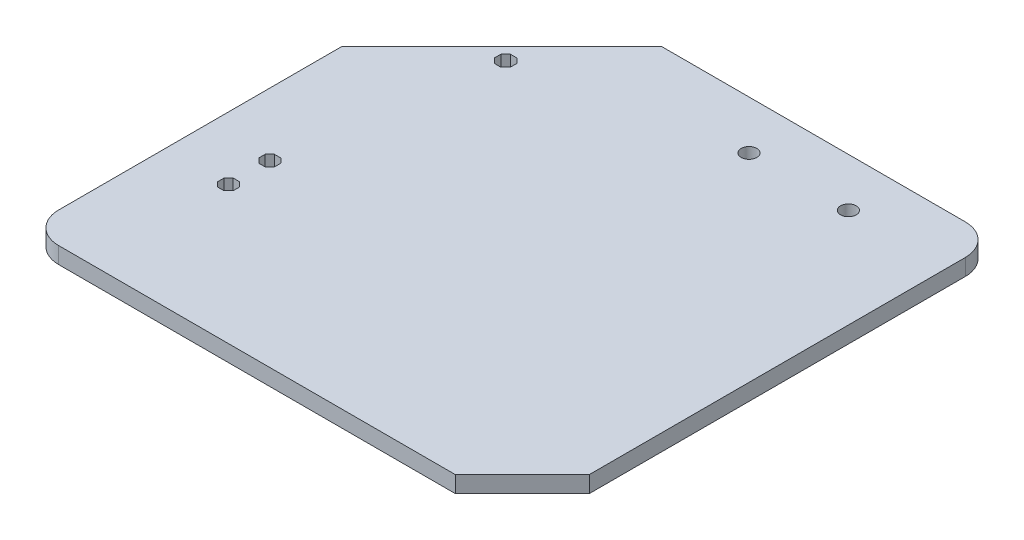
ISO-10303-21;
HEADER;
FILE_DESCRIPTION(('STEP AP214'),'2;1');
FILE_NAME('part.step','',(''),(''),'','','');
FILE_SCHEMA(('AUTOMOTIVE_DESIGN { 1 0 10303 214 1 1 1 1 }'));
ENDSEC;
DATA;
#1=APPLICATION_CONTEXT('core data for automotive mechanical design processes');
#2=APPLICATION_PROTOCOL_DEFINITION('international standard','automotive_design',2000,#1);
#3=PRODUCT_CONTEXT('',#1,'mechanical');
#4=PRODUCT('Part','Part','',(#3));
#5=PRODUCT_RELATED_PRODUCT_CATEGORY('part','',(#4));
#6=PRODUCT_DEFINITION_FORMATION('','',#4);
#7=PRODUCT_DEFINITION_CONTEXT('part definition',#1,'design');
#8=PRODUCT_DEFINITION('design','',#6,#7);
#9=PRODUCT_DEFINITION_SHAPE('','',#8);
#10=(LENGTH_UNIT() NAMED_UNIT(*) SI_UNIT(.MILLI.,.METRE.));
#11=(NAMED_UNIT(*) PLANE_ANGLE_UNIT() SI_UNIT($,.RADIAN.));
#12=(NAMED_UNIT(*) SI_UNIT($,.STERADIAN.) SOLID_ANGLE_UNIT());
#13=UNCERTAINTY_MEASURE_WITH_UNIT(LENGTH_MEASURE(1.E-05),#10,'distance_accuracy_value','');
#14=(GEOMETRIC_REPRESENTATION_CONTEXT(3) GLOBAL_UNCERTAINTY_ASSIGNED_CONTEXT((#13)) GLOBAL_UNIT_ASSIGNED_CONTEXT((#10,
#11,#12)) REPRESENTATION_CONTEXT('',''));
#15=CARTESIAN_POINT('',(0.,0.,0.));
#16=DIRECTION('',(0.,0.,1.));
#17=DIRECTION('',(1.,0.,0.));
#18=AXIS2_PLACEMENT_3D('',#15,#16,#17);
#19=CARTESIAN_POINT('',(24.,0.8,0.));
#20=DIRECTION('',(-1.,0.,0.));
#21=DIRECTION('',(0.,0.,1.));
#22=AXIS2_PLACEMENT_3D('',#19,#20,#21);
#23=PLANE('',#22);
#24=DIRECTION('',(0.,0.,-1.));
#25=VECTOR('',#24,1.);
#26=CARTESIAN_POINT('',(24.,0.,0.));
#27=LINE('',#26,#25);
#28=CARTESIAN_POINT('',(24.,0.,-8.));
#29=VERTEX_POINT('',#28);
#30=CARTESIAN_POINT('',(24.,0.,-26.25));
#31=VERTEX_POINT('',#30);
#32=EDGE_CURVE('E337',#29,#31,#27,.T.);
#33=ORIENTED_EDGE('',*,*,#32,.T.);
#34=DIRECTION('',(0.,-1.,0.));
#35=VECTOR('',#34,1.);
#36=CARTESIAN_POINT('',(24.,0.8,-26.25));
#37=LINE('',#36,#35);
#38=CARTESIAN_POINT('',(24.,0.8,-26.25));
#39=VERTEX_POINT('',#38);
#40=EDGE_CURVE('E11',#39,#31,#37,.T.);
#41=ORIENTED_EDGE('',*,*,#40,.F.);
#42=DIRECTION('',(0.,0.,-1.));
#43=VECTOR('',#42,1.);
#44=CARTESIAN_POINT('',(24.,0.8,0.));
#45=LINE('',#44,#43);
#46=CARTESIAN_POINT('',(24.,0.8,-8.));
#47=VERTEX_POINT('',#46);
#48=EDGE_CURVE('E504',#47,#39,#45,.T.);
#49=ORIENTED_EDGE('',*,*,#48,.F.);
#50=DIRECTION('',(0.,-1.,0.));
#51=VECTOR('',#50,1.);
#52=CARTESIAN_POINT('',(24.,0.8,-8.));
#53=LINE('',#52,#51);
#54=EDGE_CURVE('E52',#47,#29,#53,.T.);
#55=ORIENTED_EDGE('',*,*,#54,.T.);
#56=EDGE_LOOP('',(#33,#41,#49,#55));
#57=FACE_BOUND('',#56,.T.);
#58=ADVANCED_FACE('F33',(#57),#23,.F.);
#59=CARTESIAN_POINT('',(22.5,0.8,-26.25));
#60=DIRECTION('',(0.,-1.,0.));
#61=DIRECTION('',(0.,0.,-1.));
#62=AXIS2_PLACEMENT_3D('',#59,#60,#61);
#63=CYLINDRICAL_SURFACE('',#62,1.5);
#64=CARTESIAN_POINT('',(22.5,0.,-26.25));
#65=DIRECTION('',(0.,1.,0.));
#66=DIRECTION('',(0.,0.,1.));
#67=AXIS2_PLACEMENT_3D('',#64,#65,#66);
#68=CIRCLE('',#67,1.5);
#69=CARTESIAN_POINT('',(22.5,0.,-27.75));
#70=VERTEX_POINT('',#69);
#71=EDGE_CURVE('E339',#31,#70,#68,.T.);
#72=ORIENTED_EDGE('',*,*,#71,.T.);
#73=DIRECTION('',(0.,-1.,0.));
#74=VECTOR('',#73,1.);
#75=CARTESIAN_POINT('',(22.5,0.8,-27.75));
#76=LINE('',#75,#74);
#77=CARTESIAN_POINT('',(22.5,0.8,-27.75));
#78=VERTEX_POINT('',#77);
#79=EDGE_CURVE('E43',#78,#70,#76,.T.);
#80=ORIENTED_EDGE('',*,*,#79,.F.);
#81=CARTESIAN_POINT('',(22.5,0.8,-26.25));
#82=DIRECTION('',(0.,1.,0.));
#83=DIRECTION('',(0.,0.,1.));
#84=AXIS2_PLACEMENT_3D('',#81,#82,#83);
#85=CIRCLE('',#84,1.5);
#86=EDGE_CURVE('E506',#39,#78,#85,.T.);
#87=ORIENTED_EDGE('',*,*,#86,.F.);
#88=ORIENTED_EDGE('',*,*,#40,.T.);
#89=EDGE_LOOP('',(#72,#80,#87,#88));
#90=FACE_BOUND('',#89,.T.);
#91=ADVANCED_FACE('F536',(#90),#63,.T.);
#92=CARTESIAN_POINT('',(0.,0.8,-27.75));
#93=DIRECTION('',(0.,0.,1.));
#94=DIRECTION('',(1.,0.,0.));
#95=AXIS2_PLACEMENT_3D('',#92,#93,#94);
#96=PLANE('',#95);
#97=DIRECTION('',(-1.,0.,0.));
#98=VECTOR('',#97,1.);
#99=CARTESIAN_POINT('',(0.,0.,-27.75));
#100=LINE('',#99,#98);
#101=CARTESIAN_POINT('',(7.75,0.,-27.75));
#102=VERTEX_POINT('',#101);
#103=EDGE_CURVE('E341',#70,#102,#100,.T.);
#104=ORIENTED_EDGE('',*,*,#103,.T.);
#105=DIRECTION('',(0.,-1.,0.));
#106=VECTOR('',#105,1.);
#107=CARTESIAN_POINT('',(7.75,0.8,-27.75));
#108=LINE('',#107,#106);
#109=CARTESIAN_POINT('',(7.75,0.8,-27.75));
#110=VERTEX_POINT('',#109);
#111=EDGE_CURVE('E361',#110,#102,#108,.T.);
#112=ORIENTED_EDGE('',*,*,#111,.F.);
#113=DIRECTION('',(-1.,0.,0.));
#114=VECTOR('',#113,1.);
#115=CARTESIAN_POINT('',(0.,0.8,-27.75));
#116=LINE('',#115,#114);
#117=EDGE_CURVE('E508',#78,#110,#116,.T.);
#118=ORIENTED_EDGE('',*,*,#117,.F.);
#119=ORIENTED_EDGE('',*,*,#79,.T.);
#120=EDGE_LOOP('',(#104,#112,#118,#119));
#121=FACE_BOUND('',#120,.T.);
#122=ADVANCED_FACE('F541',(#121),#96,.F.);
#123=CARTESIAN_POINT('',(-10.,0.8,-10.));
#124=DIRECTION('',(0.707106781186548,0.,0.707106781186548));
#125=DIRECTION('',(0.707106781186548,0.,-0.707106781186548));
#126=AXIS2_PLACEMENT_3D('',#123,#124,#125);
#127=PLANE('',#126);
#128=DIRECTION('',(-0.707106781186548,0.,0.707106781186548));
#129=VECTOR('',#128,1.);
#130=CARTESIAN_POINT('',(-10.,0.,-10.));
#131=LINE('',#130,#129);
#132=CARTESIAN_POINT('',(0.,0.,-20.));
#133=VERTEX_POINT('',#132);
#134=EDGE_CURVE('E343',#102,#133,#131,.T.);
#135=ORIENTED_EDGE('',*,*,#134,.T.);
#136=DIRECTION('',(0.,-1.,0.));
#137=VECTOR('',#136,1.);
#138=CARTESIAN_POINT('',(0.,0.8,-20.));
#139=LINE('',#138,#137);
#140=CARTESIAN_POINT('',(0.,0.8,-20.));
#141=VERTEX_POINT('',#140);
#142=EDGE_CURVE('E358',#141,#133,#139,.T.);
#143=ORIENTED_EDGE('',*,*,#142,.F.);
#144=DIRECTION('',(-0.707106781186548,0.,0.707106781186548));
#145=VECTOR('',#144,1.);
#146=CARTESIAN_POINT('',(-10.,0.8,-10.));
#147=LINE('',#146,#145);
#148=EDGE_CURVE('E510',#110,#141,#147,.T.);
#149=ORIENTED_EDGE('',*,*,#148,.F.);
#150=ORIENTED_EDGE('',*,*,#111,.T.);
#151=EDGE_LOOP('',(#135,#143,#149,#150));
#152=FACE_BOUND('',#151,.T.);
#153=ADVANCED_FACE('F516',(#152),#127,.F.);
#154=CARTESIAN_POINT('',(0.,0.8,0.));
#155=DIRECTION('',(1.,0.,0.));
#156=DIRECTION('',(0.,0.,-1.));
#157=AXIS2_PLACEMENT_3D('',#154,#155,#156);
#158=PLANE('',#157);
#159=DIRECTION('',(0.,0.,1.));
#160=VECTOR('',#159,1.);
#161=CARTESIAN_POINT('',(0.,0.,0.));
#162=LINE('',#161,#160);
#163=CARTESIAN_POINT('',(0.,0.,-6.25));
#164=VERTEX_POINT('',#163);
#165=EDGE_CURVE('E345',#133,#164,#162,.T.);
#166=ORIENTED_EDGE('',*,*,#165,.T.);
#167=DIRECTION('',(0.,-1.,0.));
#168=VECTOR('',#167,1.);
#169=CARTESIAN_POINT('',(0.,0.8,-6.25));
#170=LINE('',#169,#168);
#171=CARTESIAN_POINT('',(0.,0.8,-6.25));
#172=VERTEX_POINT('',#171);
#173=EDGE_CURVE('E271',#172,#164,#170,.T.);
#174=ORIENTED_EDGE('',*,*,#173,.F.);
#175=DIRECTION('',(0.,0.,1.));
#176=VECTOR('',#175,1.);
#177=CARTESIAN_POINT('',(0.,0.8,0.));
#178=LINE('',#177,#176);
#179=EDGE_CURVE('E259',#141,#172,#178,.T.);
#180=ORIENTED_EDGE('',*,*,#179,.F.);
#181=ORIENTED_EDGE('',*,*,#142,.T.);
#182=EDGE_LOOP('',(#166,#174,#180,#181));
#183=FACE_BOUND('',#182,.T.);
#184=ADVANCED_FACE('F520',(#183),#158,.F.);
#185=CARTESIAN_POINT('',(1.5,0.8,-6.25));
#186=DIRECTION('',(0.,-1.,0.));
#187=DIRECTION('',(0.,0.,-1.));
#188=AXIS2_PLACEMENT_3D('',#185,#186,#187);
#189=CYLINDRICAL_SURFACE('',#188,1.5);
#190=CARTESIAN_POINT('',(1.5,0.,-6.25));
#191=DIRECTION('',(0.,1.,0.));
#192=DIRECTION('',(0.,0.,1.));
#193=AXIS2_PLACEMENT_3D('',#190,#191,#192);
#194=CIRCLE('',#193,1.5);
#195=CARTESIAN_POINT('',(1.5,0.,-4.75));
#196=VERTEX_POINT('',#195);
#197=EDGE_CURVE('E268',#164,#196,#194,.T.);
#198=ORIENTED_EDGE('',*,*,#197,.T.);
#199=DIRECTION('',(0.,-1.,0.));
#200=VECTOR('',#199,1.);
#201=CARTESIAN_POINT('',(1.5,0.8,-4.75));
#202=LINE('',#201,#200);
#203=CARTESIAN_POINT('',(1.5,0.8,-4.75));
#204=VERTEX_POINT('',#203);
#205=EDGE_CURVE('E265',#204,#196,#202,.T.);
#206=ORIENTED_EDGE('',*,*,#205,.F.);
#207=CARTESIAN_POINT('',(1.5,0.8,-6.25));
#208=DIRECTION('',(0.,1.,0.));
#209=DIRECTION('',(0.,0.,1.));
#210=AXIS2_PLACEMENT_3D('',#207,#208,#209);
#211=CIRCLE('',#210,1.5);
#212=EDGE_CURVE('E251',#172,#204,#211,.T.);
#213=ORIENTED_EDGE('',*,*,#212,.F.);
#214=ORIENTED_EDGE('',*,*,#173,.T.);
#215=EDGE_LOOP('',(#198,#206,#213,#214));
#216=FACE_BOUND('',#215,.T.);
#217=ADVANCED_FACE('F266',(#216),#189,.T.);
#218=CARTESIAN_POINT('',(0.,0.8,-4.75));
#219=DIRECTION('',(0.,0.,-1.));
#220=DIRECTION('',(-1.,0.,0.));
#221=AXIS2_PLACEMENT_3D('',#218,#219,#220);
#222=PLANE('',#221);
#223=DIRECTION('',(1.,0.,0.));
#224=VECTOR('',#223,1.);
#225=CARTESIAN_POINT('',(0.,0.,-4.75));
#226=LINE('',#225,#224);
#227=CARTESIAN_POINT('',(20.75,0.,-4.75));
#228=VERTEX_POINT('',#227);
#229=EDGE_CURVE('E348',#196,#228,#226,.T.);
#230=ORIENTED_EDGE('',*,*,#229,.T.);
#231=DIRECTION('',(0.,-1.,0.));
#232=VECTOR('',#231,1.);
#233=CARTESIAN_POINT('',(20.75,0.8,-4.75));
#234=LINE('',#233,#232);
#235=CARTESIAN_POINT('',(20.75,0.8,-4.75));
#236=VERTEX_POINT('',#235);
#237=EDGE_CURVE('E151',#236,#228,#234,.T.);
#238=ORIENTED_EDGE('',*,*,#237,.F.);
#239=DIRECTION('',(1.,0.,0.));
#240=VECTOR('',#239,1.);
#241=CARTESIAN_POINT('',(0.,0.8,-4.75));
#242=LINE('',#241,#240);
#243=EDGE_CURVE('E257',#204,#236,#242,.T.);
#244=ORIENTED_EDGE('',*,*,#243,.F.);
#245=ORIENTED_EDGE('',*,*,#205,.T.);
#246=EDGE_LOOP('',(#230,#238,#244,#245));
#247=FACE_BOUND('',#246,.T.);
#248=ADVANCED_FACE('F273',(#247),#222,.F.);
#249=CARTESIAN_POINT('',(3.4258,0.8,0.));
#250=DIRECTION('',(1.,0.,0.));
#251=DIRECTION('',(0.,0.,-1.));
#252=AXIS2_PLACEMENT_3D('',#249,#250,#251);
#253=PLANE('',#252);
#254=DIRECTION('',(0.,0.,1.));
#255=VECTOR('',#254,1.);
#256=CARTESIAN_POINT('',(3.4258,0.,0.));
#257=LINE('',#256,#255);
#258=CARTESIAN_POINT('',(3.4258,0.,-11.60256032));
#259=VERTEX_POINT('',#258);
#260=CARTESIAN_POINT('',(3.4258,0.,-11.28943968));
#261=VERTEX_POINT('',#260);
#262=EDGE_CURVE('E320',#259,#261,#257,.T.);
#263=ORIENTED_EDGE('',*,*,#262,.T.);
#264=DIRECTION('',(0.,-1.,0.));
#265=VECTOR('',#264,1.);
#266=CARTESIAN_POINT('',(3.4258,0.8,-11.28943968));
#267=LINE('',#266,#265);
#268=CARTESIAN_POINT('',(3.4258,0.8,-11.28943968));
#269=VERTEX_POINT('',#268);
#270=EDGE_CURVE('E355',#269,#261,#267,.T.);
#271=ORIENTED_EDGE('',*,*,#270,.F.);
#272=DIRECTION('',(0.,0.,1.));
#273=VECTOR('',#272,1.);
#274=CARTESIAN_POINT('',(3.4258,0.8,0.));
#275=LINE('',#274,#273);
#276=CARTESIAN_POINT('',(3.4258,0.8,-11.60256032));
#277=VERTEX_POINT('',#276);
#278=EDGE_CURVE('E487',#277,#269,#275,.T.);
#279=ORIENTED_EDGE('',*,*,#278,.F.);
#280=DIRECTION('',(0.,-1.,0.));
#281=VECTOR('',#280,1.);
#282=CARTESIAN_POINT('',(3.4258,0.8,-11.60256032));
#283=LINE('',#282,#281);
#284=EDGE_CURVE('E366',#277,#259,#283,.T.);
#285=ORIENTED_EDGE('',*,*,#284,.T.);
#286=EDGE_LOOP('',(#263,#271,#279,#285));
#287=FACE_BOUND('',#286,.T.);
#288=ADVANCED_FACE('F576',(#287),#253,.F.);
#289=CARTESIAN_POINT('',(-3.93181984,0.8,-3.93181983999999));
#290=DIRECTION('',(0.707106781186548,0.,0.707106781186547));
#291=DIRECTION('',(0.707106781186547,0.,-0.707106781186548));
#292=AXIS2_PLACEMENT_3D('',#289,#290,#291);
#293=PLANE('',#292);
#294=DIRECTION('',(-0.707106781186547,0.,0.707106781186548));
#295=VECTOR('',#294,1.);
#296=CARTESIAN_POINT('',(-3.93181984,0.,-3.93181983999999));
#297=LINE('',#296,#295);
#298=CARTESIAN_POINT('',(3.20456032,0.,-11.0682));
#299=VERTEX_POINT('',#298);
#300=EDGE_CURVE('E323',#261,#299,#297,.T.);
#301=ORIENTED_EDGE('',*,*,#300,.T.);
#302=DIRECTION('',(0.,-1.,0.));
#303=VECTOR('',#302,1.);
#304=CARTESIAN_POINT('',(3.20456032,0.8,-11.0682));
#305=LINE('',#304,#303);
#306=CARTESIAN_POINT('',(3.20456032,0.8,-11.0682));
#307=VERTEX_POINT('',#306);
#308=EDGE_CURVE('E385',#307,#299,#305,.T.);
#309=ORIENTED_EDGE('',*,*,#308,.F.);
#310=DIRECTION('',(-0.707106781186547,0.,0.707106781186548));
#311=VECTOR('',#310,1.);
#312=CARTESIAN_POINT('',(-3.93181984,0.8,-3.93181983999999));
#313=LINE('',#312,#311);
#314=EDGE_CURVE('E490',#269,#307,#313,.T.);
#315=ORIENTED_EDGE('',*,*,#314,.F.);
#316=ORIENTED_EDGE('',*,*,#270,.T.);
#317=EDGE_LOOP('',(#301,#309,#315,#316));
#318=FACE_BOUND('',#317,.T.);
#319=ADVANCED_FACE('F572',(#318),#293,.F.);
#320=CARTESIAN_POINT('',(0.,0.8,-11.0682));
#321=DIRECTION('',(0.,0.,1.));
#322=DIRECTION('',(1.,0.,0.));
#323=AXIS2_PLACEMENT_3D('',#320,#321,#322);
#324=PLANE('',#323);
#325=DIRECTION('',(-1.,0.,0.));
#326=VECTOR('',#325,1.);
#327=CARTESIAN_POINT('',(0.,0.,-11.0682));
#328=LINE('',#327,#326);
#329=CARTESIAN_POINT('',(2.89143968,0.,-11.0682));
#330=VERTEX_POINT('',#329);
#331=EDGE_CURVE('E325',#299,#330,#328,.T.);
#332=ORIENTED_EDGE('',*,*,#331,.T.);
#333=DIRECTION('',(0.,-1.,0.));
#334=VECTOR('',#333,1.);
#335=CARTESIAN_POINT('',(2.89143968,0.8,-11.0682));
#336=LINE('',#335,#334);
#337=CARTESIAN_POINT('',(2.89143968,0.8,-11.0682));
#338=VERTEX_POINT('',#337);
#339=EDGE_CURVE('E382',#338,#330,#336,.T.);
#340=ORIENTED_EDGE('',*,*,#339,.F.);
#341=DIRECTION('',(-1.,0.,0.));
#342=VECTOR('',#341,1.);
#343=CARTESIAN_POINT('',(0.,0.8,-11.0682));
#344=LINE('',#343,#342);
#345=EDGE_CURVE('E492',#307,#338,#344,.T.);
#346=ORIENTED_EDGE('',*,*,#345,.F.);
#347=ORIENTED_EDGE('',*,*,#308,.T.);
#348=EDGE_LOOP('',(#332,#340,#346,#347));
#349=FACE_BOUND('',#348,.T.);
#350=ADVANCED_FACE('F568',(#349),#324,.F.);
#351=CARTESIAN_POINT('',(6.97981984000001,0.8,-6.97981983999998));
#352=DIRECTION('',(-0.707106781186549,0.,0.707106781186546));
#353=DIRECTION('',(0.707106781186546,0.,0.707106781186549));
#354=AXIS2_PLACEMENT_3D('',#351,#352,#353);
#355=PLANE('',#354);
#356=DIRECTION('',(-0.707106781186546,0.,-0.707106781186549));
#357=VECTOR('',#356,1.);
#358=CARTESIAN_POINT('',(6.97981984000001,0.,-6.97981983999998));
#359=LINE('',#358,#357);
#360=CARTESIAN_POINT('',(2.6702,0.,-11.28943968));
#361=VERTEX_POINT('',#360);
#362=EDGE_CURVE('E327',#330,#361,#359,.T.);
#363=ORIENTED_EDGE('',*,*,#362,.T.);
#364=DIRECTION('',(0.,-1.,0.));
#365=VECTOR('',#364,1.);
#366=CARTESIAN_POINT('',(2.6702,0.8,-11.28943968));
#367=LINE('',#366,#365);
#368=CARTESIAN_POINT('',(2.6702,0.8,-11.28943968));
#369=VERTEX_POINT('',#368);
#370=EDGE_CURVE('E379',#369,#361,#367,.T.);
#371=ORIENTED_EDGE('',*,*,#370,.F.);
#372=DIRECTION('',(-0.707106781186546,0.,-0.707106781186549));
#373=VECTOR('',#372,1.);
#374=CARTESIAN_POINT('',(6.97981984000001,0.8,-6.97981983999998));
#375=LINE('',#374,#373);
#376=EDGE_CURVE('E494',#338,#369,#375,.T.);
#377=ORIENTED_EDGE('',*,*,#376,.F.);
#378=ORIENTED_EDGE('',*,*,#339,.T.);
#379=EDGE_LOOP('',(#363,#371,#377,#378));
#380=FACE_BOUND('',#379,.T.);
#381=ADVANCED_FACE('F564',(#380),#355,.F.);
#382=CARTESIAN_POINT('',(2.6702,0.8,0.));
#383=DIRECTION('',(-1.,0.,0.));
#384=DIRECTION('',(0.,0.,1.));
#385=AXIS2_PLACEMENT_3D('',#382,#383,#384);
#386=PLANE('',#385);
#387=DIRECTION('',(0.,0.,-1.));
#388=VECTOR('',#387,1.);
#389=CARTESIAN_POINT('',(2.6702,0.,0.));
#390=LINE('',#389,#388);
#391=CARTESIAN_POINT('',(2.6702,0.,-11.60256032));
#392=VERTEX_POINT('',#391);
#393=EDGE_CURVE('E329',#361,#392,#390,.T.);
#394=ORIENTED_EDGE('',*,*,#393,.T.);
#395=DIRECTION('',(0.,-1.,0.));
#396=VECTOR('',#395,1.);
#397=CARTESIAN_POINT('',(2.6702,0.8,-11.60256032));
#398=LINE('',#397,#396);
#399=CARTESIAN_POINT('',(2.6702,0.8,-11.60256032));
#400=VERTEX_POINT('',#399);
#401=EDGE_CURVE('E376',#400,#392,#398,.T.);
#402=ORIENTED_EDGE('',*,*,#401,.F.);
#403=DIRECTION('',(0.,0.,-1.));
#404=VECTOR('',#403,1.);
#405=CARTESIAN_POINT('',(2.6702,0.8,0.));
#406=LINE('',#405,#404);
#407=EDGE_CURVE('E496',#369,#400,#406,.T.);
#408=ORIENTED_EDGE('',*,*,#407,.F.);
#409=ORIENTED_EDGE('',*,*,#370,.T.);
#410=EDGE_LOOP('',(#394,#402,#408,#409));
#411=FACE_BOUND('',#410,.T.);
#412=ADVANCED_FACE('F560',(#411),#386,.F.);
#413=CARTESIAN_POINT('',(-4.46618015999999,0.8,-4.46618015999998));
#414=DIRECTION('',(-0.707106781186549,0.,-0.707106781186546));
#415=DIRECTION('',(-0.707106781186546,0.,0.707106781186549));
#416=AXIS2_PLACEMENT_3D('',#413,#414,#415);
#417=PLANE('',#416);
#418=DIRECTION('',(0.707106781186546,0.,-0.707106781186549));
#419=VECTOR('',#418,1.);
#420=CARTESIAN_POINT('',(-4.46618015999999,0.,-4.46618015999998));
#421=LINE('',#420,#419);
#422=CARTESIAN_POINT('',(2.89143968,0.,-11.8238));
#423=VERTEX_POINT('',#422);
#424=EDGE_CURVE('E331',#392,#423,#421,.T.);
#425=ORIENTED_EDGE('',*,*,#424,.T.);
#426=DIRECTION('',(0.,-1.,0.));
#427=VECTOR('',#426,1.);
#428=CARTESIAN_POINT('',(2.89143968,0.8,-11.8238));
#429=LINE('',#428,#427);
#430=CARTESIAN_POINT('',(2.89143968,0.8,-11.8238));
#431=VERTEX_POINT('',#430);
#432=EDGE_CURVE('E373',#431,#423,#429,.T.);
#433=ORIENTED_EDGE('',*,*,#432,.F.);
#434=DIRECTION('',(0.707106781186546,0.,-0.707106781186549));
#435=VECTOR('',#434,1.);
#436=CARTESIAN_POINT('',(-4.46618015999999,0.8,-4.46618015999998));
#437=LINE('',#436,#435);
#438=EDGE_CURVE('E498',#400,#431,#437,.T.);
#439=ORIENTED_EDGE('',*,*,#438,.F.);
#440=ORIENTED_EDGE('',*,*,#401,.T.);
#441=EDGE_LOOP('',(#425,#433,#439,#440));
#442=FACE_BOUND('',#441,.T.);
#443=ADVANCED_FACE('F556',(#442),#417,.F.);
#444=CARTESIAN_POINT('',(0.,0.8,-11.8238));
#445=DIRECTION('',(0.,0.,-1.));
#446=DIRECTION('',(-1.,0.,0.));
#447=AXIS2_PLACEMENT_3D('',#444,#445,#446);
#448=PLANE('',#447);
#449=DIRECTION('',(1.,0.,0.));
#450=VECTOR('',#449,1.);
#451=CARTESIAN_POINT('',(0.,0.,-11.8238));
#452=LINE('',#451,#450);
#453=CARTESIAN_POINT('',(3.20456032,0.,-11.8238));
#454=VERTEX_POINT('',#453);
#455=EDGE_CURVE('E333',#423,#454,#452,.T.);
#456=ORIENTED_EDGE('',*,*,#455,.T.);
#457=DIRECTION('',(0.,-1.,0.));
#458=VECTOR('',#457,1.);
#459=CARTESIAN_POINT('',(3.20456032,0.8,-11.8238));
#460=LINE('',#459,#458);
#461=CARTESIAN_POINT('',(3.20456032,0.8,-11.8238));
#462=VERTEX_POINT('',#461);
#463=EDGE_CURVE('E369',#462,#454,#460,.T.);
#464=ORIENTED_EDGE('',*,*,#463,.F.);
#465=DIRECTION('',(1.,0.,0.));
#466=VECTOR('',#465,1.);
#467=CARTESIAN_POINT('',(0.,0.8,-11.8238));
#468=LINE('',#467,#466);
#469=EDGE_CURVE('E500',#431,#462,#468,.T.);
#470=ORIENTED_EDGE('',*,*,#469,.F.);
#471=ORIENTED_EDGE('',*,*,#432,.T.);
#472=EDGE_LOOP('',(#456,#464,#470,#471));
#473=FACE_BOUND('',#472,.T.);
#474=ADVANCED_FACE('F552',(#473),#448,.F.);
#475=CARTESIAN_POINT('',(3.4258,0.8,0.));
#476=DIRECTION('',(1.,0.,0.));
#477=DIRECTION('',(0.,0.,-1.));
#478=AXIS2_PLACEMENT_3D('',#475,#476,#477);
#479=PLANE('',#478);
#480=DIRECTION('',(0.,0.,1.));
#481=VECTOR('',#480,1.);
#482=CARTESIAN_POINT('',(3.4258,0.,0.));
#483=LINE('',#482,#481);
#484=CARTESIAN_POINT('',(3.4258,0.,-13.60256032));
#485=VERTEX_POINT('',#484);
#486=CARTESIAN_POINT('',(3.4258,0.,-13.28943968));
#487=VERTEX_POINT('',#486);
#488=EDGE_CURVE('E303',#485,#487,#483,.T.);
#489=ORIENTED_EDGE('',*,*,#488,.T.);
#490=DIRECTION('',(0.,-1.,0.));
#491=VECTOR('',#490,1.);
#492=CARTESIAN_POINT('',(3.4258,0.8,-13.28943968));
#493=LINE('',#492,#491);
#494=CARTESIAN_POINT('',(3.4258,0.8,-13.28943968));
#495=VERTEX_POINT('',#494);
#496=EDGE_CURVE('E370',#495,#487,#493,.T.);
#497=ORIENTED_EDGE('',*,*,#496,.F.);
#498=DIRECTION('',(0.,0.,1.));
#499=VECTOR('',#498,1.);
#500=CARTESIAN_POINT('',(3.4258,0.8,0.));
#501=LINE('',#500,#499);
#502=CARTESIAN_POINT('',(3.4258,0.8,-13.60256032));
#503=VERTEX_POINT('',#502);
#504=EDGE_CURVE('E470',#503,#495,#501,.T.);
#505=ORIENTED_EDGE('',*,*,#504,.F.);
#506=DIRECTION('',(0.,-1.,0.));
#507=VECTOR('',#506,1.);
#508=CARTESIAN_POINT('',(3.4258,0.8,-13.60256032));
#509=LINE('',#508,#507);
#510=EDGE_CURVE('E390',#503,#485,#509,.T.);
#511=ORIENTED_EDGE('',*,*,#510,.T.);
#512=EDGE_LOOP('',(#489,#497,#505,#511));
#513=FACE_BOUND('',#512,.T.);
#514=ADVANCED_FACE('F555',(#513),#479,.F.);
#515=CARTESIAN_POINT('',(-4.93181984,0.8,-4.93181983999999));
#516=DIRECTION('',(0.707106781186548,0.,0.707106781186547));
#517=DIRECTION('',(0.707106781186547,0.,-0.707106781186548));
#518=AXIS2_PLACEMENT_3D('',#515,#516,#517);
#519=PLANE('',#518);
#520=DIRECTION('',(-0.707106781186547,0.,0.707106781186548));
#521=VECTOR('',#520,1.);
#522=CARTESIAN_POINT('',(-4.93181984,0.,-4.93181983999999));
#523=LINE('',#522,#521);
#524=CARTESIAN_POINT('',(3.20456032,0.,-13.0682));
#525=VERTEX_POINT('',#524);
#526=EDGE_CURVE('E306',#487,#525,#523,.T.);
#527=ORIENTED_EDGE('',*,*,#526,.T.);
#528=DIRECTION('',(0.,-1.,0.));
#529=VECTOR('',#528,1.);
#530=CARTESIAN_POINT('',(3.20456032,0.8,-13.0682));
#531=LINE('',#530,#529);
#532=CARTESIAN_POINT('',(3.20456032,0.8,-13.0682));
#533=VERTEX_POINT('',#532);
#534=EDGE_CURVE('E408',#533,#525,#531,.T.);
#535=ORIENTED_EDGE('',*,*,#534,.F.);
#536=DIRECTION('',(-0.707106781186547,0.,0.707106781186548));
#537=VECTOR('',#536,1.);
#538=CARTESIAN_POINT('',(-4.93181984,0.8,-4.93181983999999));
#539=LINE('',#538,#537);
#540=EDGE_CURVE('E473',#495,#533,#539,.T.);
#541=ORIENTED_EDGE('',*,*,#540,.F.);
#542=ORIENTED_EDGE('',*,*,#496,.T.);
#543=EDGE_LOOP('',(#527,#535,#541,#542));
#544=FACE_BOUND('',#543,.T.);
#545=ADVANCED_FACE('F604',(#544),#519,.F.);
#546=CARTESIAN_POINT('',(0.,0.8,-13.0682));
#547=DIRECTION('',(0.,0.,1.));
#548=DIRECTION('',(1.,0.,0.));
#549=AXIS2_PLACEMENT_3D('',#546,#547,#548);
#550=PLANE('',#549);
#551=DIRECTION('',(-1.,0.,0.));
#552=VECTOR('',#551,1.);
#553=CARTESIAN_POINT('',(0.,0.,-13.0682));
#554=LINE('',#553,#552);
#555=CARTESIAN_POINT('',(2.89143968,0.,-13.0682));
#556=VERTEX_POINT('',#555);
#557=EDGE_CURVE('E308',#525,#556,#554,.T.);
#558=ORIENTED_EDGE('',*,*,#557,.T.);
#559=DIRECTION('',(0.,-1.,0.));
#560=VECTOR('',#559,1.);
#561=CARTESIAN_POINT('',(2.89143968,0.8,-13.0682));
#562=LINE('',#561,#560);
#563=CARTESIAN_POINT('',(2.89143968,0.8,-13.0682));
#564=VERTEX_POINT('',#563);
#565=EDGE_CURVE('E405',#564,#556,#562,.T.);
#566=ORIENTED_EDGE('',*,*,#565,.F.);
#567=DIRECTION('',(-1.,0.,0.));
#568=VECTOR('',#567,1.);
#569=CARTESIAN_POINT('',(0.,0.8,-13.0682));
#570=LINE('',#569,#568);
#571=EDGE_CURVE('E475',#533,#564,#570,.T.);
#572=ORIENTED_EDGE('',*,*,#571,.F.);
#573=ORIENTED_EDGE('',*,*,#534,.T.);
#574=EDGE_LOOP('',(#558,#566,#572,#573));
#575=FACE_BOUND('',#574,.T.);
#576=ADVANCED_FACE('F600',(#575),#550,.F.);
#577=CARTESIAN_POINT('',(7.97981984,0.8,-7.97981983999997));
#578=DIRECTION('',(-0.707106781186549,0.,0.707106781186546));
#579=DIRECTION('',(0.707106781186546,0.,0.707106781186549));
#580=AXIS2_PLACEMENT_3D('',#577,#578,#579);
#581=PLANE('',#580);
#582=DIRECTION('',(-0.707106781186546,0.,-0.707106781186549));
#583=VECTOR('',#582,1.);
#584=CARTESIAN_POINT('',(7.97981984,0.,-7.97981983999997));
#585=LINE('',#584,#583);
#586=CARTESIAN_POINT('',(2.6702,0.,-13.28943968));
#587=VERTEX_POINT('',#586);
#588=EDGE_CURVE('E310',#556,#587,#585,.T.);
#589=ORIENTED_EDGE('',*,*,#588,.T.);
#590=DIRECTION('',(0.,-1.,0.));
#591=VECTOR('',#590,1.);
#592=CARTESIAN_POINT('',(2.6702,0.8,-13.28943968));
#593=LINE('',#592,#591);
#594=CARTESIAN_POINT('',(2.6702,0.8,-13.28943968));
#595=VERTEX_POINT('',#594);
#596=EDGE_CURVE('E402',#595,#587,#593,.T.);
#597=ORIENTED_EDGE('',*,*,#596,.F.);
#598=DIRECTION('',(-0.707106781186546,0.,-0.707106781186549));
#599=VECTOR('',#598,1.);
#600=CARTESIAN_POINT('',(7.97981984,0.8,-7.97981983999997));
#601=LINE('',#600,#599);
#602=EDGE_CURVE('E477',#564,#595,#601,.T.);
#603=ORIENTED_EDGE('',*,*,#602,.F.);
#604=ORIENTED_EDGE('',*,*,#565,.T.);
#605=EDGE_LOOP('',(#589,#597,#603,#604));
#606=FACE_BOUND('',#605,.T.);
#607=ADVANCED_FACE('F596',(#606),#581,.F.);
#608=CARTESIAN_POINT('',(2.6702,0.8,0.));
#609=DIRECTION('',(-1.,0.,0.));
#610=DIRECTION('',(0.,0.,1.));
#611=AXIS2_PLACEMENT_3D('',#608,#609,#610);
#612=PLANE('',#611);
#613=DIRECTION('',(0.,0.,-1.));
#614=VECTOR('',#613,1.);
#615=CARTESIAN_POINT('',(2.6702,0.,0.));
#616=LINE('',#615,#614);
#617=CARTESIAN_POINT('',(2.6702,0.,-13.60256032));
#618=VERTEX_POINT('',#617);
#619=EDGE_CURVE('E312',#587,#618,#616,.T.);
#620=ORIENTED_EDGE('',*,*,#619,.T.);
#621=DIRECTION('',(0.,-1.,0.));
#622=VECTOR('',#621,1.);
#623=CARTESIAN_POINT('',(2.6702,0.8,-13.60256032));
#624=LINE('',#623,#622);
#625=CARTESIAN_POINT('',(2.6702,0.8,-13.60256032));
#626=VERTEX_POINT('',#625);
#627=EDGE_CURVE('E399',#626,#618,#624,.T.);
#628=ORIENTED_EDGE('',*,*,#627,.F.);
#629=DIRECTION('',(0.,0.,-1.));
#630=VECTOR('',#629,1.);
#631=CARTESIAN_POINT('',(2.6702,0.8,0.));
#632=LINE('',#631,#630);
#633=EDGE_CURVE('E479',#595,#626,#632,.T.);
#634=ORIENTED_EDGE('',*,*,#633,.F.);
#635=ORIENTED_EDGE('',*,*,#596,.T.);
#636=EDGE_LOOP('',(#620,#628,#634,#635));
#637=FACE_BOUND('',#636,.T.);
#638=ADVANCED_FACE('F592',(#637),#612,.F.);
#639=CARTESIAN_POINT('',(-5.46618015999999,0.8,-5.46618015999997));
#640=DIRECTION('',(-0.707106781186549,0.,-0.707106781186546));
#641=DIRECTION('',(-0.707106781186546,0.,0.707106781186549));
#642=AXIS2_PLACEMENT_3D('',#639,#640,#641);
#643=PLANE('',#642);
#644=DIRECTION('',(0.707106781186546,0.,-0.707106781186549));
#645=VECTOR('',#644,1.);
#646=CARTESIAN_POINT('',(-5.46618015999999,0.,-5.46618015999997));
#647=LINE('',#646,#645);
#648=CARTESIAN_POINT('',(2.89143968,0.,-13.8238));
#649=VERTEX_POINT('',#648);
#650=EDGE_CURVE('E314',#618,#649,#647,.T.);
#651=ORIENTED_EDGE('',*,*,#650,.T.);
#652=DIRECTION('',(0.,-1.,0.));
#653=VECTOR('',#652,1.);
#654=CARTESIAN_POINT('',(2.89143968,0.8,-13.8238));
#655=LINE('',#654,#653);
#656=CARTESIAN_POINT('',(2.89143968,0.8,-13.8238));
#657=VERTEX_POINT('',#656);
#658=EDGE_CURVE('E396',#657,#649,#655,.T.);
#659=ORIENTED_EDGE('',*,*,#658,.F.);
#660=DIRECTION('',(0.707106781186546,0.,-0.707106781186549));
#661=VECTOR('',#660,1.);
#662=CARTESIAN_POINT('',(-5.46618015999999,0.8,-5.46618015999997));
#663=LINE('',#662,#661);
#664=EDGE_CURVE('E481',#626,#657,#663,.T.);
#665=ORIENTED_EDGE('',*,*,#664,.F.);
#666=ORIENTED_EDGE('',*,*,#627,.T.);
#667=EDGE_LOOP('',(#651,#659,#665,#666));
#668=FACE_BOUND('',#667,.T.);
#669=ADVANCED_FACE('F588',(#668),#643,.F.);
#670=CARTESIAN_POINT('',(0.,0.8,-13.8238));
#671=DIRECTION('',(0.,0.,-1.));
#672=DIRECTION('',(-1.,0.,0.));
#673=AXIS2_PLACEMENT_3D('',#670,#671,#672);
#674=PLANE('',#673);
#675=DIRECTION('',(1.,0.,0.));
#676=VECTOR('',#675,1.);
#677=CARTESIAN_POINT('',(0.,0.,-13.8238));
#678=LINE('',#677,#676);
#679=CARTESIAN_POINT('',(3.20456032,0.,-13.8238));
#680=VERTEX_POINT('',#679);
#681=EDGE_CURVE('E316',#649,#680,#678,.T.);
#682=ORIENTED_EDGE('',*,*,#681,.T.);
#683=DIRECTION('',(0.,-1.,0.));
#684=VECTOR('',#683,1.);
#685=CARTESIAN_POINT('',(3.20456032,0.8,-13.8238));
#686=LINE('',#685,#684);
#687=CARTESIAN_POINT('',(3.20456032,0.8,-13.8238));
#688=VERTEX_POINT('',#687);
#689=EDGE_CURVE('E393',#688,#680,#686,.T.);
#690=ORIENTED_EDGE('',*,*,#689,.F.);
#691=DIRECTION('',(1.,0.,0.));
#692=VECTOR('',#691,1.);
#693=CARTESIAN_POINT('',(0.,0.8,-13.8238));
#694=LINE('',#693,#692);
#695=EDGE_CURVE('E483',#657,#688,#694,.T.);
#696=ORIENTED_EDGE('',*,*,#695,.F.);
#697=ORIENTED_EDGE('',*,*,#658,.T.);
#698=EDGE_LOOP('',(#682,#690,#696,#697));
#699=FACE_BOUND('',#698,.T.);
#700=ADVANCED_FACE('F585',(#699),#674,.F.);
#701=CARTESIAN_POINT('',(0.,0.8,-22.9797));
#702=DIRECTION('',(0.,0.,1.));
#703=DIRECTION('',(1.,0.,0.));
#704=AXIS2_PLACEMENT_3D('',#701,#702,#703);
#705=PLANE('',#704);
#706=DIRECTION('',(-1.,0.,0.));
#707=VECTOR('',#706,1.);
#708=CARTESIAN_POINT('',(0.,0.,-22.9797));
#709=LINE('',#708,#707);
#710=CARTESIAN_POINT('',(4.73291152,0.,-22.9797));
#711=VERTEX_POINT('',#710);
#712=CARTESIAN_POINT('',(4.41108848,0.,-22.9797));
#713=VERTEX_POINT('',#712);
#714=EDGE_CURVE('E286',#711,#713,#709,.T.);
#715=ORIENTED_EDGE('',*,*,#714,.T.);
#716=DIRECTION('',(0.,-1.,0.));
#717=VECTOR('',#716,1.);
#718=CARTESIAN_POINT('',(4.41108848,0.8,-22.9797));
#719=LINE('',#718,#717);
#720=CARTESIAN_POINT('',(4.41108848,0.8,-22.9797));
#721=VERTEX_POINT('',#720);
#722=EDGE_CURVE('E37',#721,#713,#719,.T.);
#723=ORIENTED_EDGE('',*,*,#722,.F.);
#724=DIRECTION('',(-1.,0.,0.));
#725=VECTOR('',#724,1.);
#726=CARTESIAN_POINT('',(0.,0.8,-22.9797));
#727=LINE('',#726,#725);
#728=CARTESIAN_POINT('',(4.73291152,0.8,-22.9797));
#729=VERTEX_POINT('',#728);
#730=EDGE_CURVE('E879',#729,#721,#727,.T.);
#731=ORIENTED_EDGE('',*,*,#730,.F.);
#732=DIRECTION('',(0.,-1.,0.));
#733=VECTOR('',#732,1.);
#734=CARTESIAN_POINT('',(4.73291152,0.8,-22.9797));
#735=LINE('',#734,#733);
#736=EDGE_CURVE('E276',#729,#711,#735,.T.);
#737=ORIENTED_EDGE('',*,*,#736,.T.);
#738=EDGE_LOOP('',(#715,#723,#731,#737));
#739=FACE_BOUND('',#738,.T.);
#740=ADVANCED_FACE('F439',(#739),#705,.F.);
#741=CARTESIAN_POINT('',(13.69539424,0.8,-13.69539424));
#742=DIRECTION('',(-0.707106781186548,0.,0.707106781186548));
#743=DIRECTION('',(0.707106781186548,0.,0.707106781186548));
#744=AXIS2_PLACEMENT_3D('',#741,#742,#743);
#745=PLANE('',#744);
#746=DIRECTION('',(-0.707106781186548,0.,-0.707106781186548));
#747=VECTOR('',#746,1.);
#748=CARTESIAN_POINT('',(13.69539424,0.,-13.69539424));
#749=LINE('',#748,#747);
#750=CARTESIAN_POINT('',(4.1837,0.,-23.20708848));
#751=VERTEX_POINT('',#750);
#752=EDGE_CURVE('E289',#713,#751,#749,.T.);
#753=ORIENTED_EDGE('',*,*,#752,.T.);
#754=DIRECTION('',(0.,-1.,0.));
#755=VECTOR('',#754,1.);
#756=CARTESIAN_POINT('',(4.1837,0.8,-23.20708848));
#757=LINE('',#756,#755);
#758=CARTESIAN_POINT('',(4.1837,0.8,-23.20708848));
#759=VERTEX_POINT('',#758);
#760=EDGE_CURVE('E429',#759,#751,#757,.T.);
#761=ORIENTED_EDGE('',*,*,#760,.F.);
#762=DIRECTION('',(-0.707106781186548,0.,-0.707106781186548));
#763=VECTOR('',#762,1.);
#764=CARTESIAN_POINT('',(13.69539424,0.8,-13.69539424));
#765=LINE('',#764,#763);
#766=EDGE_CURVE('E164',#721,#759,#765,.T.);
#767=ORIENTED_EDGE('',*,*,#766,.F.);
#768=ORIENTED_EDGE('',*,*,#722,.T.);
#769=EDGE_LOOP('',(#753,#761,#767,#768));
#770=FACE_BOUND('',#769,.T.);
#771=ADVANCED_FACE('F435',(#770),#745,.F.);
#772=CARTESIAN_POINT('',(4.1837,0.8,0.));
#773=DIRECTION('',(-1.,0.,0.));
#774=DIRECTION('',(0.,0.,1.));
#775=AXIS2_PLACEMENT_3D('',#772,#773,#774);
#776=PLANE('',#775);
#777=DIRECTION('',(0.,0.,-1.));
#778=VECTOR('',#777,1.);
#779=CARTESIAN_POINT('',(4.1837,0.,0.));
#780=LINE('',#779,#778);
#781=CARTESIAN_POINT('',(4.1837,0.,-23.52891152));
#782=VERTEX_POINT('',#781);
#783=EDGE_CURVE('E291',#751,#782,#780,.T.);
#784=ORIENTED_EDGE('',*,*,#783,.T.);
#785=DIRECTION('',(0.,-1.,0.));
#786=VECTOR('',#785,1.);
#787=CARTESIAN_POINT('',(4.1837,0.8,-23.52891152));
#788=LINE('',#787,#786);
#789=CARTESIAN_POINT('',(4.1837,0.8,-23.52891152));
#790=VERTEX_POINT('',#789);
#791=EDGE_CURVE('E427',#790,#782,#788,.T.);
#792=ORIENTED_EDGE('',*,*,#791,.F.);
#793=DIRECTION('',(0.,0.,-1.));
#794=VECTOR('',#793,1.);
#795=CARTESIAN_POINT('',(4.1837,0.8,0.));
#796=LINE('',#795,#794);
#797=EDGE_CURVE('E458',#759,#790,#796,.T.);
#798=ORIENTED_EDGE('',*,*,#797,.F.);
#799=ORIENTED_EDGE('',*,*,#760,.T.);
#800=EDGE_LOOP('',(#784,#792,#798,#799));
#801=FACE_BOUND('',#800,.T.);
#802=ADVANCED_FACE('F449',(#801),#776,.F.);
#803=CARTESIAN_POINT('',(-9.67260575999997,0.8,-9.67260575999981));
#804=DIRECTION('',(-0.707106781186553,0.,-0.707106781186542));
#805=DIRECTION('',(-0.707106781186542,0.,0.707106781186553));
#806=AXIS2_PLACEMENT_3D('',#803,#804,#805);
#807=PLANE('',#806);
#808=DIRECTION('',(0.707106781186542,0.,-0.707106781186553));
#809=VECTOR('',#808,1.);
#810=CARTESIAN_POINT('',(-9.67260575999997,0.,-9.67260575999981));
#811=LINE('',#810,#809);
#812=CARTESIAN_POINT('',(4.41108848,0.,-23.7563));
#813=VERTEX_POINT('',#812);
#814=EDGE_CURVE('E293',#782,#813,#811,.T.);
#815=ORIENTED_EDGE('',*,*,#814,.T.);
#816=DIRECTION('',(0.,-1.,0.));
#817=VECTOR('',#816,1.);
#818=CARTESIAN_POINT('',(4.41108848,0.8,-23.7563));
#819=LINE('',#818,#817);
#820=CARTESIAN_POINT('',(4.41108848,0.8,-23.7563));
#821=VERTEX_POINT('',#820);
#822=EDGE_CURVE('E424',#821,#813,#819,.T.);
#823=ORIENTED_EDGE('',*,*,#822,.F.);
#824=DIRECTION('',(0.707106781186542,0.,-0.707106781186553));
#825=VECTOR('',#824,1.);
#826=CARTESIAN_POINT('',(-9.67260575999997,0.8,-9.67260575999981));
#827=LINE('',#826,#825);
#828=EDGE_CURVE('E454',#790,#821,#827,.T.);
#829=ORIENTED_EDGE('',*,*,#828,.F.);
#830=ORIENTED_EDGE('',*,*,#791,.T.);
#831=EDGE_LOOP('',(#815,#823,#829,#830));
#832=FACE_BOUND('',#831,.T.);
#833=ADVANCED_FACE('F452',(#832),#807,.F.);
#834=CARTESIAN_POINT('',(0.,0.8,-23.7563));
#835=DIRECTION('',(0.,0.,-1.));
#836=DIRECTION('',(-1.,0.,0.));
#837=AXIS2_PLACEMENT_3D('',#834,#835,#836);
#838=PLANE('',#837);
#839=DIRECTION('',(1.,0.,0.));
#840=VECTOR('',#839,1.);
#841=CARTESIAN_POINT('',(0.,0.,-23.7563));
#842=LINE('',#841,#840);
#843=CARTESIAN_POINT('',(4.73291152,0.,-23.7563));
#844=VERTEX_POINT('',#843);
#845=EDGE_CURVE('E295',#813,#844,#842,.T.);
#846=ORIENTED_EDGE('',*,*,#845,.T.);
#847=DIRECTION('',(0.,-1.,0.));
#848=VECTOR('',#847,1.);
#849=CARTESIAN_POINT('',(4.73291152,0.8,-23.7563));
#850=LINE('',#849,#848);
#851=CARTESIAN_POINT('',(4.73291152,0.8,-23.7563));
#852=VERTEX_POINT('',#851);
#853=EDGE_CURVE('E421',#852,#844,#850,.T.);
#854=ORIENTED_EDGE('',*,*,#853,.F.);
#855=DIRECTION('',(1.,0.,0.));
#856=VECTOR('',#855,1.);
#857=CARTESIAN_POINT('',(0.,0.8,-23.7563));
#858=LINE('',#857,#856);
#859=EDGE_CURVE('E457',#821,#852,#858,.T.);
#860=ORIENTED_EDGE('',*,*,#859,.F.);
#861=ORIENTED_EDGE('',*,*,#822,.T.);
#862=EDGE_LOOP('',(#846,#854,#860,#861));
#863=FACE_BOUND('',#862,.T.);
#864=ADVANCED_FACE('F621',(#863),#838,.F.);
#865=CARTESIAN_POINT('',(14.24460576,0.8,-14.2446057599998));
#866=DIRECTION('',(0.707106781186553,0.,-0.707106781186542));
#867=DIRECTION('',(-0.707106781186542,0.,-0.707106781186553));
#868=AXIS2_PLACEMENT_3D('',#865,#866,#867);
#869=PLANE('',#868);
#870=DIRECTION('',(0.707106781186542,0.,0.707106781186553));
#871=VECTOR('',#870,1.);
#872=CARTESIAN_POINT('',(14.24460576,0.,-14.2446057599998));
#873=LINE('',#872,#871);
#874=CARTESIAN_POINT('',(4.9603,0.,-23.52891152));
#875=VERTEX_POINT('',#874);
#876=EDGE_CURVE('E297',#844,#875,#873,.T.);
#877=ORIENTED_EDGE('',*,*,#876,.T.);
#878=DIRECTION('',(0.,-1.,0.));
#879=VECTOR('',#878,1.);
#880=CARTESIAN_POINT('',(4.9603,0.8,-23.52891152));
#881=LINE('',#880,#879);
#882=CARTESIAN_POINT('',(4.9603,0.8,-23.52891152));
#883=VERTEX_POINT('',#882);
#884=EDGE_CURVE('E418',#883,#875,#881,.T.);
#885=ORIENTED_EDGE('',*,*,#884,.F.);
#886=DIRECTION('',(0.707106781186542,0.,0.707106781186553));
#887=VECTOR('',#886,1.);
#888=CARTESIAN_POINT('',(14.24460576,0.8,-14.2446057599998));
#889=LINE('',#888,#887);
#890=EDGE_CURVE('E460',#852,#883,#889,.T.);
#891=ORIENTED_EDGE('',*,*,#890,.F.);
#892=ORIENTED_EDGE('',*,*,#853,.T.);
#893=EDGE_LOOP('',(#877,#885,#891,#892));
#894=FACE_BOUND('',#893,.T.);
#895=ADVANCED_FACE('F617',(#894),#869,.F.);
#896=CARTESIAN_POINT('',(4.9603,0.8,0.));
#897=DIRECTION('',(1.,0.,0.));
#898=DIRECTION('',(0.,0.,-1.));
#899=AXIS2_PLACEMENT_3D('',#896,#897,#898);
#900=PLANE('',#899);
#901=DIRECTION('',(0.,0.,1.));
#902=VECTOR('',#901,1.);
#903=CARTESIAN_POINT('',(4.9603,0.,0.));
#904=LINE('',#903,#902);
#905=CARTESIAN_POINT('',(4.9603,0.,-23.20708848));
#906=VERTEX_POINT('',#905);
#907=EDGE_CURVE('E299',#875,#906,#904,.T.);
#908=ORIENTED_EDGE('',*,*,#907,.T.);
#909=DIRECTION('',(0.,-1.,0.));
#910=VECTOR('',#909,1.);
#911=CARTESIAN_POINT('',(4.9603,0.8,-23.20708848));
#912=LINE('',#911,#910);
#913=CARTESIAN_POINT('',(4.9603,0.8,-23.20708848));
#914=VERTEX_POINT('',#913);
#915=EDGE_CURVE('E415',#914,#906,#912,.T.);
#916=ORIENTED_EDGE('',*,*,#915,.F.);
#917=DIRECTION('',(0.,0.,1.));
#918=VECTOR('',#917,1.);
#919=CARTESIAN_POINT('',(4.9603,0.8,0.));
#920=LINE('',#919,#918);
#921=EDGE_CURVE('E466',#883,#914,#920,.T.);
#922=ORIENTED_EDGE('',*,*,#921,.F.);
#923=ORIENTED_EDGE('',*,*,#884,.T.);
#924=EDGE_LOOP('',(#908,#916,#922,#923));
#925=FACE_BOUND('',#924,.T.);
#926=ADVANCED_FACE('F550',(#925),#900,.F.);
#927=CARTESIAN_POINT('',(7.51418016,0.8,-7.51418015999999));
#928=DIRECTION('',(0.707106781186548,0.,-0.707106781186547));
#929=DIRECTION('',(-0.707106781186547,0.,-0.707106781186548));
#930=AXIS2_PLACEMENT_3D('',#927,#928,#929);
#931=PLANE('',#930);
#932=DIRECTION('',(0.707106781186547,0.,0.707106781186548));
#933=VECTOR('',#932,1.);
#934=CARTESIAN_POINT('',(7.51418016,0.,-7.51418015999999));
#935=LINE('',#934,#933);
#936=EDGE_CURVE('E335',#454,#259,#935,.T.);
#937=ORIENTED_EDGE('',*,*,#936,.T.);
#938=ORIENTED_EDGE('',*,*,#284,.F.);
#939=DIRECTION('',(0.707106781186547,0.,0.707106781186548));
#940=VECTOR('',#939,1.);
#941=CARTESIAN_POINT('',(7.51418016,0.8,-7.51418015999999));
#942=LINE('',#941,#940);
#943=EDGE_CURVE('E502',#462,#277,#942,.T.);
#944=ORIENTED_EDGE('',*,*,#943,.F.);
#945=ORIENTED_EDGE('',*,*,#463,.T.);
#946=EDGE_LOOP('',(#937,#938,#944,#945));
#947=FACE_BOUND('',#946,.T.);
#948=ADVANCED_FACE('F546',(#947),#931,.F.);
#949=CARTESIAN_POINT('',(8.51418016,0.8,-8.51418015999998));
#950=DIRECTION('',(0.707106781186548,0.,-0.707106781186547));
#951=DIRECTION('',(-0.707106781186547,0.,-0.707106781186548));
#952=AXIS2_PLACEMENT_3D('',#949,#950,#951);
#953=PLANE('',#952);
#954=DIRECTION('',(0.707106781186547,0.,0.707106781186548));
#955=VECTOR('',#954,1.);
#956=CARTESIAN_POINT('',(8.51418016,0.,-8.51418015999998));
#957=LINE('',#956,#955);
#958=EDGE_CURVE('E318',#680,#485,#957,.T.);
#959=ORIENTED_EDGE('',*,*,#958,.T.);
#960=ORIENTED_EDGE('',*,*,#510,.F.);
#961=DIRECTION('',(0.707106781186547,0.,0.707106781186548));
#962=VECTOR('',#961,1.);
#963=CARTESIAN_POINT('',(8.51418016,0.8,-8.51418015999998));
#964=LINE('',#963,#962);
#965=EDGE_CURVE('E485',#688,#503,#964,.T.);
#966=ORIENTED_EDGE('',*,*,#965,.F.);
#967=ORIENTED_EDGE('',*,*,#689,.T.);
#968=EDGE_LOOP('',(#959,#960,#966,#967));
#969=FACE_BOUND('',#968,.T.);
#970=ADVANCED_FACE('F549',(#969),#953,.F.);
#971=CARTESIAN_POINT('',(-9.12339424,0.8,-9.12339424));
#972=DIRECTION('',(0.707106781186548,0.,0.707106781186548));
#973=DIRECTION('',(0.707106781186548,0.,-0.707106781186548));
#974=AXIS2_PLACEMENT_3D('',#971,#972,#973);
#975=PLANE('',#974);
#976=DIRECTION('',(-0.707106781186548,0.,0.707106781186548));
#977=VECTOR('',#976,1.);
#978=CARTESIAN_POINT('',(-9.12339424,0.,-9.12339424));
#979=LINE('',#978,#977);
#980=EDGE_CURVE('E301',#906,#711,#979,.T.);
#981=ORIENTED_EDGE('',*,*,#980,.T.);
#982=ORIENTED_EDGE('',*,*,#736,.F.);
#983=DIRECTION('',(-0.707106781186548,0.,0.707106781186548));
#984=VECTOR('',#983,1.);
#985=CARTESIAN_POINT('',(-9.12339424,0.8,-9.12339424));
#986=LINE('',#985,#984);
#987=EDGE_CURVE('E468',#914,#729,#986,.T.);
#988=ORIENTED_EDGE('',*,*,#987,.F.);
#989=ORIENTED_EDGE('',*,*,#915,.T.);
#990=EDGE_LOOP('',(#981,#982,#988,#989));
#991=FACE_BOUND('',#990,.T.);
#992=ADVANCED_FACE('F583',(#991),#975,.F.);
#993=CARTESIAN_POINT('',(19.181,0.8,-25.396));
#994=DIRECTION('',(0.,-1.,0.));
#995=DIRECTION('',(0.,0.,-1.));
#996=AXIS2_PLACEMENT_3D('',#993,#994,#995);
#997=CYLINDRICAL_SURFACE('',#996,0.380999999999999);
#998=CARTESIAN_POINT('',(19.181,0.8,-25.396));
#999=DIRECTION('',(0.,1.,0.));
#1000=DIRECTION('',(0.,0.,1.));
#1001=AXIS2_PLACEMENT_3D('',#998,#999,#1000);
#1002=CIRCLE('',#1001,0.380999999999999);
#1003=CARTESIAN_POINT('',(19.181,0.8,-25.015));
#1004=VERTEX_POINT('',#1003);
#1005=EDGE_CURVE('E640',#1004,#1004,#1002,.T.);
#1006=ORIENTED_EDGE('',*,*,#1005,.T.);
#1007=EDGE_LOOP('',(#1006));
#1008=FACE_BOUND('',#1007,.T.);
#1009=CARTESIAN_POINT('',(19.181,0.,-25.396));
#1010=DIRECTION('',(0.,1.,0.));
#1011=DIRECTION('',(0.,0.,1.));
#1012=AXIS2_PLACEMENT_3D('',#1009,#1010,#1011);
#1013=CIRCLE('',#1012,0.380999999999999);
#1014=CARTESIAN_POINT('',(19.181,0.,-25.015));
#1015=VERTEX_POINT('',#1014);
#1016=EDGE_CURVE('E283',#1015,#1015,#1013,.T.);
#1017=ORIENTED_EDGE('',*,*,#1016,.F.);
#1018=EDGE_LOOP('',(#1017));
#1019=FACE_BOUND('',#1018,.T.);
#1020=ADVANCED_FACE('F531',(#1008,#1019),#997,.F.);
#1021=CARTESIAN_POINT('',(14.355,0.8,-25.396));
#1022=DIRECTION('',(0.,-1.,0.));
#1023=DIRECTION('',(0.,0.,-1.));
#1024=AXIS2_PLACEMENT_3D('',#1021,#1022,#1023);
#1025=CYLINDRICAL_SURFACE('',#1024,0.380999999999999);
#1026=CARTESIAN_POINT('',(14.355,0.8,-25.396));
#1027=DIRECTION('',(0.,1.,0.));
#1028=DIRECTION('',(0.,0.,1.));
#1029=AXIS2_PLACEMENT_3D('',#1026,#1027,#1028);
#1030=CIRCLE('',#1029,0.380999999999999);
#1031=CARTESIAN_POINT('',(14.355,0.8,-25.015));
#1032=VERTEX_POINT('',#1031);
#1033=EDGE_CURVE('E353',#1032,#1032,#1030,.T.);
#1034=ORIENTED_EDGE('',*,*,#1033,.T.);
#1035=EDGE_LOOP('',(#1034));
#1036=FACE_BOUND('',#1035,.T.);
#1037=CARTESIAN_POINT('',(14.355,0.,-25.396));
#1038=DIRECTION('',(0.,1.,0.));
#1039=DIRECTION('',(0.,0.,1.));
#1040=AXIS2_PLACEMENT_3D('',#1037,#1038,#1039);
#1041=CIRCLE('',#1040,0.380999999999999);
#1042=CARTESIAN_POINT('',(14.355,0.,-25.015));
#1043=VERTEX_POINT('',#1042);
#1044=EDGE_CURVE('E280',#1043,#1043,#1041,.T.);
#1045=ORIENTED_EDGE('',*,*,#1044,.F.);
#1046=EDGE_LOOP('',(#1045));
#1047=FACE_BOUND('',#1046,.T.);
#1048=ADVANCED_FACE('F35',(#1036,#1047),#1025,.F.);
#1049=CARTESIAN_POINT('',(8.,0.8,8.));
#1050=DIRECTION('',(0.707106781186548,0.,0.707106781186548));
#1051=DIRECTION('',(0.707106781186548,0.,-0.707106781186548));
#1052=AXIS2_PLACEMENT_3D('',#1049,#1050,#1051);
#1053=PLANE('',#1052);
#1054=DIRECTION('',(-0.707106781186548,0.,0.707106781186548));
#1055=VECTOR('',#1054,1.);
#1056=CARTESIAN_POINT('',(8.,0.,8.));
#1057=LINE('',#1056,#1055);
#1058=EDGE_CURVE('E350',#29,#228,#1057,.T.);
#1059=ORIENTED_EDGE('',*,*,#1058,.F.);
#1060=ORIENTED_EDGE('',*,*,#54,.F.);
#1061=DIRECTION('',(-0.707106781186548,0.,0.707106781186548));
#1062=VECTOR('',#1061,1.);
#1063=CARTESIAN_POINT('',(8.,0.8,8.));
#1064=LINE('',#1063,#1062);
#1065=EDGE_CURVE('E274',#47,#236,#1064,.T.);
#1066=ORIENTED_EDGE('',*,*,#1065,.T.);
#1067=ORIENTED_EDGE('',*,*,#237,.T.);
#1068=EDGE_LOOP('',(#1059,#1060,#1066,#1067));
#1069=FACE_BOUND('',#1068,.T.);
#1070=ADVANCED_FACE('F522',(#1069),#1053,.T.);
#1071=CARTESIAN_POINT('',(0.,0.8,0.));
#1072=DIRECTION('',(0.,1.,0.));
#1073=DIRECTION('',(0.,0.,1.));
#1074=AXIS2_PLACEMENT_3D('',#1071,#1072,#1073);
#1075=PLANE('',#1074);
#1076=ORIENTED_EDGE('',*,*,#1033,.F.);
#1077=EDGE_LOOP('',(#1076));
#1078=FACE_BOUND('',#1077,.T.);
#1079=ORIENTED_EDGE('',*,*,#1005,.F.);
#1080=EDGE_LOOP('',(#1079));
#1081=FACE_BOUND('',#1080,.T.);
#1082=ORIENTED_EDGE('',*,*,#730,.T.);
#1083=ORIENTED_EDGE('',*,*,#766,.T.);
#1084=ORIENTED_EDGE('',*,*,#797,.T.);
#1085=ORIENTED_EDGE('',*,*,#828,.T.);
#1086=ORIENTED_EDGE('',*,*,#859,.T.);
#1087=ORIENTED_EDGE('',*,*,#890,.T.);
#1088=ORIENTED_EDGE('',*,*,#921,.T.);
#1089=ORIENTED_EDGE('',*,*,#987,.T.);
#1090=EDGE_LOOP('',(#1082,#1083,#1084,#1085,#1086,#1087,#1088,#1089));
#1091=FACE_BOUND('',#1090,.T.);
#1092=ORIENTED_EDGE('',*,*,#504,.T.);
#1093=ORIENTED_EDGE('',*,*,#540,.T.);
#1094=ORIENTED_EDGE('',*,*,#571,.T.);
#1095=ORIENTED_EDGE('',*,*,#602,.T.);
#1096=ORIENTED_EDGE('',*,*,#633,.T.);
#1097=ORIENTED_EDGE('',*,*,#664,.T.);
#1098=ORIENTED_EDGE('',*,*,#695,.T.);
#1099=ORIENTED_EDGE('',*,*,#965,.T.);
#1100=EDGE_LOOP('',(#1092,#1093,#1094,#1095,#1096,#1097,#1098,#1099));
#1101=FACE_BOUND('',#1100,.T.);
#1102=ORIENTED_EDGE('',*,*,#278,.T.);
#1103=ORIENTED_EDGE('',*,*,#314,.T.);
#1104=ORIENTED_EDGE('',*,*,#345,.T.);
#1105=ORIENTED_EDGE('',*,*,#376,.T.);
#1106=ORIENTED_EDGE('',*,*,#407,.T.);
#1107=ORIENTED_EDGE('',*,*,#438,.T.);
#1108=ORIENTED_EDGE('',*,*,#469,.T.);
#1109=ORIENTED_EDGE('',*,*,#943,.T.);
#1110=EDGE_LOOP('',(#1102,#1103,#1104,#1105,#1106,#1107,#1108,#1109));
#1111=FACE_BOUND('',#1110,.T.);
#1112=ORIENTED_EDGE('',*,*,#48,.T.);
#1113=ORIENTED_EDGE('',*,*,#86,.T.);
#1114=ORIENTED_EDGE('',*,*,#117,.T.);
#1115=ORIENTED_EDGE('',*,*,#148,.T.);
#1116=ORIENTED_EDGE('',*,*,#179,.T.);
#1117=ORIENTED_EDGE('',*,*,#212,.T.);
#1118=ORIENTED_EDGE('',*,*,#243,.T.);
#1119=ORIENTED_EDGE('',*,*,#1065,.F.);
#1120=EDGE_LOOP('',(#1112,#1113,#1114,#1115,#1116,#1117,#1118,#1119));
#1121=FACE_BOUND('',#1120,.T.);
#1122=ADVANCED_FACE('F254',(#1078,#1081,#1091,#1101,#1111,#1121),#1075,.T.);
#1123=CARTESIAN_POINT('',(0.,0.,0.));
#1124=DIRECTION('',(0.,1.,0.));
#1125=DIRECTION('',(0.,0.,1.));
#1126=AXIS2_PLACEMENT_3D('',#1123,#1124,#1125);
#1127=PLANE('',#1126);
#1128=ORIENTED_EDGE('',*,*,#1044,.T.);
#1129=EDGE_LOOP('',(#1128));
#1130=FACE_BOUND('',#1129,.T.);
#1131=ORIENTED_EDGE('',*,*,#1016,.T.);
#1132=EDGE_LOOP('',(#1131));
#1133=FACE_BOUND('',#1132,.T.);
#1134=ORIENTED_EDGE('',*,*,#714,.F.);
#1135=ORIENTED_EDGE('',*,*,#980,.F.);
#1136=ORIENTED_EDGE('',*,*,#907,.F.);
#1137=ORIENTED_EDGE('',*,*,#876,.F.);
#1138=ORIENTED_EDGE('',*,*,#845,.F.);
#1139=ORIENTED_EDGE('',*,*,#814,.F.);
#1140=ORIENTED_EDGE('',*,*,#783,.F.);
#1141=ORIENTED_EDGE('',*,*,#752,.F.);
#1142=EDGE_LOOP('',(#1134,#1135,#1136,#1137,#1138,#1139,#1140,#1141));
#1143=FACE_BOUND('',#1142,.T.);
#1144=ORIENTED_EDGE('',*,*,#488,.F.);
#1145=ORIENTED_EDGE('',*,*,#958,.F.);
#1146=ORIENTED_EDGE('',*,*,#681,.F.);
#1147=ORIENTED_EDGE('',*,*,#650,.F.);
#1148=ORIENTED_EDGE('',*,*,#619,.F.);
#1149=ORIENTED_EDGE('',*,*,#588,.F.);
#1150=ORIENTED_EDGE('',*,*,#557,.F.);
#1151=ORIENTED_EDGE('',*,*,#526,.F.);
#1152=EDGE_LOOP('',(#1144,#1145,#1146,#1147,#1148,#1149,#1150,#1151));
#1153=FACE_BOUND('',#1152,.T.);
#1154=ORIENTED_EDGE('',*,*,#262,.F.);
#1155=ORIENTED_EDGE('',*,*,#936,.F.);
#1156=ORIENTED_EDGE('',*,*,#455,.F.);
#1157=ORIENTED_EDGE('',*,*,#424,.F.);
#1158=ORIENTED_EDGE('',*,*,#393,.F.);
#1159=ORIENTED_EDGE('',*,*,#362,.F.);
#1160=ORIENTED_EDGE('',*,*,#331,.F.);
#1161=ORIENTED_EDGE('',*,*,#300,.F.);
#1162=EDGE_LOOP('',(#1154,#1155,#1156,#1157,#1158,#1159,#1160,#1161));
#1163=FACE_BOUND('',#1162,.T.);
#1164=ORIENTED_EDGE('',*,*,#32,.F.);
#1165=ORIENTED_EDGE('',*,*,#1058,.T.);
#1166=ORIENTED_EDGE('',*,*,#229,.F.);
#1167=ORIENTED_EDGE('',*,*,#197,.F.);
#1168=ORIENTED_EDGE('',*,*,#165,.F.);
#1169=ORIENTED_EDGE('',*,*,#134,.F.);
#1170=ORIENTED_EDGE('',*,*,#103,.F.);
#1171=ORIENTED_EDGE('',*,*,#71,.F.);
#1172=EDGE_LOOP('',(#1164,#1165,#1166,#1167,#1168,#1169,#1170,#1171));
#1173=FACE_BOUND('',#1172,.T.);
#1174=ADVANCED_FACE('F443',(#1130,#1133,#1143,#1153,#1163,#1173),#1127,.F.);
#1175=CLOSED_SHELL('',(#58,#91,#122,#153,#184,#217,#248,#288,#319,#350,#381,#412,#443,#474,#514,
#545,#576,#607,#638,#669,#700,#740,#771,#802,#833,#864,#895,#926,#948,#970,#992,#1020,#1048,
#1070,#1122,#1174));
#1176=MANIFOLD_SOLID_BREP('B2',#1175);
#1177=ADVANCED_BREP_SHAPE_REPRESENTATION('',(#18,#1176),#14);
#1178=SHAPE_DEFINITION_REPRESENTATION(#9,#1177);
ENDSEC;
END-ISO-10303-21;
